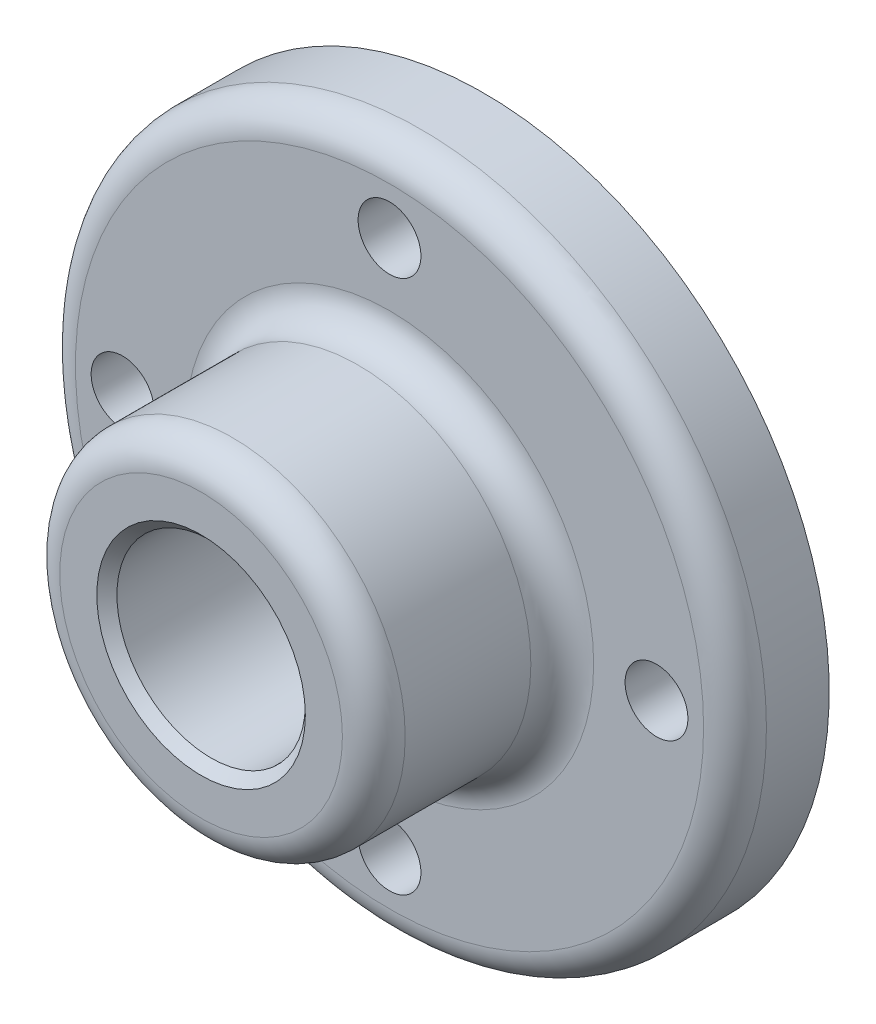
ISO-10303-21;
HEADER;
FILE_DESCRIPTION(('STEP AP214'),'2;1');
FILE_NAME('part.step','',(''),(''),'','','');
FILE_SCHEMA(('AUTOMOTIVE_DESIGN { 1 0 10303 214 1 1 1 1 }'));
ENDSEC;
DATA;
#1=APPLICATION_CONTEXT('core data for automotive mechanical design processes');
#2=APPLICATION_PROTOCOL_DEFINITION('international standard','automotive_design',2000,#1);
#3=PRODUCT_CONTEXT('',#1,'mechanical');
#4=PRODUCT('Part','Part','',(#3));
#5=PRODUCT_RELATED_PRODUCT_CATEGORY('part','',(#4));
#6=PRODUCT_DEFINITION_FORMATION('','',#4);
#7=PRODUCT_DEFINITION_CONTEXT('part definition',#1,'design');
#8=PRODUCT_DEFINITION('design','',#6,#7);
#9=PRODUCT_DEFINITION_SHAPE('','',#8);
#10=(LENGTH_UNIT() NAMED_UNIT(*) SI_UNIT(.MILLI.,.METRE.));
#11=(NAMED_UNIT(*) PLANE_ANGLE_UNIT() SI_UNIT($,.RADIAN.));
#12=(NAMED_UNIT(*) SI_UNIT($,.STERADIAN.) SOLID_ANGLE_UNIT());
#13=UNCERTAINTY_MEASURE_WITH_UNIT(LENGTH_MEASURE(1.E-05),#10,'distance_accuracy_value','');
#14=(GEOMETRIC_REPRESENTATION_CONTEXT(3) GLOBAL_UNCERTAINTY_ASSIGNED_CONTEXT((#13)) GLOBAL_UNIT_ASSIGNED_CONTEXT((#10,
#11,#12)) REPRESENTATION_CONTEXT('',''));
#15=CARTESIAN_POINT('',(0.,0.,0.));
#16=DIRECTION('',(0.,0.,1.));
#17=DIRECTION('',(1.,0.,0.));
#18=AXIS2_PLACEMENT_3D('',#15,#16,#17);
#19=CARTESIAN_POINT('',(0.,0.,19.05));
#20=DIRECTION('',(0.,0.,-1.));
#21=DIRECTION('',(-1.,0.,0.));
#22=AXIS2_PLACEMENT_3D('',#19,#20,#21);
#23=CYLINDRICAL_SURFACE('',#22,69.85);
#24=CARTESIAN_POINT('',(0.,0.,12.7));
#25=DIRECTION('',(0.,0.,1.));
#26=DIRECTION('',(1.,0.,0.));
#27=AXIS2_PLACEMENT_3D('',#24,#25,#26);
#28=CIRCLE('',#27,69.85);
#29=CARTESIAN_POINT('',(-69.85,0.,12.7));
#30=VERTEX_POINT('',#29);
#31=EDGE_CURVE('E64',#30,#30,#28,.F.);
#32=CARTESIAN_POINT('',(0.,0.,0.));
#33=DIRECTION('',(0.,0.,1.));
#34=DIRECTION('',(1.,0.,0.));
#35=AXIS2_PLACEMENT_3D('',#32,#33,#34);
#36=CIRCLE('',#35,69.85);
#37=CARTESIAN_POINT('',(-69.85,0.,0.));
#38=VERTEX_POINT('',#37);
#39=EDGE_CURVE('E76',#38,#38,#36,.T.);
#40=CARTESIAN_POINT('',(-69.85,0.,12.7));
#41=CARTESIAN_POINT('',(-69.85,0.,12.5677083333333));
#42=CARTESIAN_POINT('',(-69.85,0.,12.4354166666667));
#43=CARTESIAN_POINT('',(-69.85,0.,12.1708333333333));
#44=CARTESIAN_POINT('',(-69.85,0.,12.0385416666667));
#45=CARTESIAN_POINT('',(-69.85,0.,11.7739583333333));
#46=CARTESIAN_POINT('',(-69.85,0.,11.6416666666667));
#47=CARTESIAN_POINT('',(-69.85,0.,11.3770833333333));
#48=CARTESIAN_POINT('',(-69.85,0.,11.2447916666667));
#49=CARTESIAN_POINT('',(-69.85,0.,10.9802083333333));
#50=CARTESIAN_POINT('',(-69.85,0.,10.8479166666667));
#51=CARTESIAN_POINT('',(-69.85,0.,10.5833333333333));
#52=CARTESIAN_POINT('',(-69.85,0.,10.4510416666667));
#53=CARTESIAN_POINT('',(-69.85,0.,10.1864583333333));
#54=CARTESIAN_POINT('',(-69.85,0.,10.0541666666667));
#55=CARTESIAN_POINT('',(-69.85,0.,9.78958333333333));
#56=CARTESIAN_POINT('',(-69.85,0.,9.65729166666667));
#57=CARTESIAN_POINT('',(-69.85,0.,9.39270833333333));
#58=CARTESIAN_POINT('',(-69.85,0.,9.26041666666667));
#59=CARTESIAN_POINT('',(-69.85,0.,8.99583333333334));
#60=CARTESIAN_POINT('',(-69.85,0.,8.86354166666667));
#61=CARTESIAN_POINT('',(-69.85,0.,8.59895833333333));
#62=CARTESIAN_POINT('',(-69.85,0.,8.46666666666667));
#63=CARTESIAN_POINT('',(-69.85,0.,8.20208333333333));
#64=CARTESIAN_POINT('',(-69.85,0.,8.06979166666667));
#65=CARTESIAN_POINT('',(-69.85,0.,7.80520833333333));
#66=CARTESIAN_POINT('',(-69.85,0.,7.67291666666667));
#67=CARTESIAN_POINT('',(-69.85,0.,7.40833333333333));
#68=CARTESIAN_POINT('',(-69.85,0.,7.27604166666667));
#69=CARTESIAN_POINT('',(-69.85,0.,7.01145833333333));
#70=CARTESIAN_POINT('',(-69.85,0.,6.87916666666667));
#71=CARTESIAN_POINT('',(-69.85,0.,6.61458333333333));
#72=CARTESIAN_POINT('',(-69.85,0.,6.48229166666667));
#73=CARTESIAN_POINT('',(-69.85,0.,6.21770833333333));
#74=CARTESIAN_POINT('',(-69.85,0.,6.08541666666667));
#75=CARTESIAN_POINT('',(-69.85,0.,5.82083333333333));
#76=CARTESIAN_POINT('',(-69.85,0.,5.68854166666667));
#77=CARTESIAN_POINT('',(-69.85,0.,5.42395833333333));
#78=CARTESIAN_POINT('',(-69.85,0.,5.29166666666667));
#79=CARTESIAN_POINT('',(-69.85,0.,5.02708333333333));
#80=CARTESIAN_POINT('',(-69.85,0.,4.89479166666667));
#81=CARTESIAN_POINT('',(-69.85,0.,4.63020833333333));
#82=CARTESIAN_POINT('',(-69.85,0.,4.49791666666667));
#83=CARTESIAN_POINT('',(-69.85,0.,4.23333333333333));
#84=CARTESIAN_POINT('',(-69.85,0.,4.10104166666667));
#85=CARTESIAN_POINT('',(-69.85,0.,3.83645833333333));
#86=CARTESIAN_POINT('',(-69.85,0.,3.70416666666667));
#87=CARTESIAN_POINT('',(-69.85,0.,3.43958333333333));
#88=CARTESIAN_POINT('',(-69.85,0.,3.30729166666667));
#89=CARTESIAN_POINT('',(-69.85,0.,3.04270833333333));
#90=CARTESIAN_POINT('',(-69.85,0.,2.91041666666667));
#91=CARTESIAN_POINT('',(-69.85,0.,2.64583333333333));
#92=CARTESIAN_POINT('',(-69.85,0.,2.51354166666667));
#93=CARTESIAN_POINT('',(-69.85,0.,2.24895833333333));
#94=CARTESIAN_POINT('',(-69.85,0.,2.11666666666667));
#95=CARTESIAN_POINT('',(-69.85,0.,1.85208333333333));
#96=CARTESIAN_POINT('',(-69.85,0.,1.71979166666667));
#97=CARTESIAN_POINT('',(-69.85,0.,1.45520833333333));
#98=CARTESIAN_POINT('',(-69.85,0.,1.32291666666667));
#99=CARTESIAN_POINT('',(-69.85,0.,1.05833333333333));
#100=CARTESIAN_POINT('',(-69.85,0.,0.926041666666666));
#101=CARTESIAN_POINT('',(-69.85,0.,0.661458333333332));
#102=CARTESIAN_POINT('',(-69.85,0.,0.529166666666665));
#103=CARTESIAN_POINT('',(-69.85,0.,0.264583333333332));
#104=CARTESIAN_POINT('',(-69.85,0.,0.132291666666666));
#105=CARTESIAN_POINT('',(-69.85,0.,0.));
#106=B_SPLINE_CURVE_WITH_KNOTS('',3,(#40,#41,#42,#43,#44,#45,#46,#47,#48,#49,#50,#51,#52,#53,
#54,#55,#56,#57,#58,#59,#60,#61,#62,#63,#64,#65,#66,#67,#68,#69,#70,#71,#72,#73,#74,#75,#76,#77,
#78,#79,#80,#81,#82,#83,#84,#85,#86,#87,#88,#89,#90,#91,#92,#93,#94,#95,#96,#97,#98,#99,#100,
#101,#102,#103,#104,#105),.UNSPECIFIED.,.F.,.F.,(4,2,2,2,2,2,2,2,2,2,2,2,2,2,2,2,2,2,2,2,2,2,2,
2,2,2,2,2,2,2,2,2,4),(0.,0.396874999999998,0.793749999999999,1.190625,1.5875,1.984375,2.38125,
2.778125,3.175,3.571875,3.96875,4.365625,4.7625,5.159375,5.55625,5.953125,6.35,6.746875,7.14375,
7.540625,7.9375,8.334375,8.73125,9.128125,9.525,9.921875,10.31875,10.715625,11.1125,11.509375,
11.90625,12.303125,12.7),.UNSPECIFIED.);
#107=EDGE_CURVE('BSEAM36',#30,#38,#106,.T.);
#108=ORIENTED_EDGE('',*,*,#31,.T.);
#109=ORIENTED_EDGE('',*,*,#39,.T.);
#110=ORIENTED_EDGE('',*,*,#107,.T.);
#111=ORIENTED_EDGE('',*,*,#107,.F.);
#112=EDGE_LOOP('',(#108,#110,#109,#111));
#113=FACE_BOUND('',#112,.T.);
#114=ADVANCED_FACE('F36',(#113),#23,.T.);
#115=CARTESIAN_POINT('',(0.,0.,19.05));
#116=DIRECTION('',(0.,0.,1.));
#117=DIRECTION('',(1.,0.,0.));
#118=AXIS2_PLACEMENT_3D('',#115,#116,#117);
#119=PLANE('',#118);
#120=CARTESIAN_POINT('',(0.,0.,19.05));
#121=DIRECTION('',(0.,0.,1.));
#122=DIRECTION('',(1.,0.,0.));
#123=AXIS2_PLACEMENT_3D('',#120,#121,#122);
#124=CIRCLE('',#123,63.5);
#125=CARTESIAN_POINT('',(63.5,0.,19.05));
#126=VERTEX_POINT('',#125);
#127=EDGE_CURVE('E68',#126,#126,#124,.T.);
#128=ORIENTED_EDGE('',*,*,#127,.T.);
#129=EDGE_LOOP('',(#128));
#130=FACE_BOUND('',#129,.T.);
#131=CARTESIAN_POINT('',(0.,0.,19.05));
#132=DIRECTION('',(0.,0.,1.));
#133=DIRECTION('',(1.,0.,0.));
#134=AXIS2_PLACEMENT_3D('',#131,#132,#133);
#135=CIRCLE('',#134,41.275);
#136=CARTESIAN_POINT('',(41.275,0.,19.05));
#137=VERTEX_POINT('',#136);
#138=EDGE_CURVE('E72',#137,#137,#135,.F.);
#139=ORIENTED_EDGE('',*,*,#138,.T.);
#140=EDGE_LOOP('',(#139));
#141=FACE_BOUND('',#140,.T.);
#142=CARTESIAN_POINT('',(-53.975,-1.88452705264058E-13,19.05));
#143=DIRECTION('',(0.,0.,1.));
#144=DIRECTION('',(1.,0.,0.));
#145=AXIS2_PLACEMENT_3D('',#142,#143,#144);
#146=CIRCLE('',#145,6.35);
#147=CARTESIAN_POINT('',(-47.625,-1.88452705264058E-13,19.05));
#148=VERTEX_POINT('',#147);
#149=EDGE_CURVE('E92',#148,#148,#146,.T.);
#150=ORIENTED_EDGE('',*,*,#149,.F.);
#151=EDGE_LOOP('',(#150));
#152=FACE_BOUND('',#151,.T.);
#153=CARTESIAN_POINT('',(0.,-53.975,19.05));
#154=DIRECTION('',(0.,0.,1.));
#155=DIRECTION('',(1.,0.,0.));
#156=AXIS2_PLACEMENT_3D('',#153,#154,#155);
#157=CIRCLE('',#156,6.35);
#158=CARTESIAN_POINT('',(6.35,-53.975,19.05));
#159=VERTEX_POINT('',#158);
#160=EDGE_CURVE('E96',#159,#159,#157,.T.);
#161=ORIENTED_EDGE('',*,*,#160,.F.);
#162=EDGE_LOOP('',(#161));
#163=FACE_BOUND('',#162,.T.);
#164=CARTESIAN_POINT('',(53.975,5.65358115792174E-13,19.05));
#165=DIRECTION('',(0.,0.,1.));
#166=DIRECTION('',(1.,0.,0.));
#167=AXIS2_PLACEMENT_3D('',#164,#165,#166);
#168=CIRCLE('',#167,6.35);
#169=CARTESIAN_POINT('',(60.325,5.65358115792174E-13,19.05));
#170=VERTEX_POINT('',#169);
#171=EDGE_CURVE('E100',#170,#170,#168,.T.);
#172=ORIENTED_EDGE('',*,*,#171,.F.);
#173=EDGE_LOOP('',(#172));
#174=FACE_BOUND('',#173,.T.);
#175=CARTESIAN_POINT('',(0.,53.975,19.05));
#176=DIRECTION('',(0.,0.,1.));
#177=DIRECTION('',(1.,0.,0.));
#178=AXIS2_PLACEMENT_3D('',#175,#176,#177);
#179=CIRCLE('',#178,6.35);
#180=CARTESIAN_POINT('',(6.35,53.975,19.05));
#181=VERTEX_POINT('',#180);
#182=EDGE_CURVE('E84',#181,#181,#179,.T.);
#183=ORIENTED_EDGE('',*,*,#182,.F.);
#184=EDGE_LOOP('',(#183));
#185=FACE_BOUND('',#184,.T.);
#186=ADVANCED_FACE('F137',(#130,#141,#152,#163,#174,#185),#119,.T.);
#187=CARTESIAN_POINT('',(0.,0.,0.));
#188=DIRECTION('',(0.,0.,1.));
#189=DIRECTION('',(1.,0.,0.));
#190=AXIS2_PLACEMENT_3D('',#187,#188,#189);
#191=PLANE('',#190);
#192=CARTESIAN_POINT('',(-53.975,-1.88452705264058E-13,0.));
#193=DIRECTION('',(0.,0.,1.));
#194=DIRECTION('',(0.,1.,0.));
#195=AXIS2_PLACEMENT_3D('',#192,#193,#194);
#196=CIRCLE('',#195,6.35);
#197=CARTESIAN_POINT('',(-47.625,-1.88452705264058E-13,0.));
#198=VERTEX_POINT('',#197);
#199=EDGE_CURVE('E104',#198,#198,#196,.T.);
#200=ORIENTED_EDGE('',*,*,#199,.T.);
#201=EDGE_LOOP('',(#200));
#202=FACE_BOUND('',#201,.T.);
#203=CARTESIAN_POINT('',(0.,-53.975,0.));
#204=DIRECTION('',(0.,0.,1.));
#205=DIRECTION('',(-1.,0.,0.));
#206=AXIS2_PLACEMENT_3D('',#203,#204,#205);
#207=CIRCLE('',#206,6.35);
#208=CARTESIAN_POINT('',(6.35,-53.975,0.));
#209=VERTEX_POINT('',#208);
#210=EDGE_CURVE('E109',#209,#209,#207,.T.);
#211=ORIENTED_EDGE('',*,*,#210,.T.);
#212=EDGE_LOOP('',(#211));
#213=FACE_BOUND('',#212,.T.);
#214=CARTESIAN_POINT('',(53.975,5.65358115792174E-13,0.));
#215=DIRECTION('',(0.,0.,1.));
#216=DIRECTION('',(0.,-1.,0.));
#217=AXIS2_PLACEMENT_3D('',#214,#215,#216);
#218=CIRCLE('',#217,6.35);
#219=CARTESIAN_POINT('',(60.325,5.65358115792174E-13,0.));
#220=VERTEX_POINT('',#219);
#221=EDGE_CURVE('E105',#220,#220,#218,.T.);
#222=ORIENTED_EDGE('',*,*,#221,.T.);
#223=EDGE_LOOP('',(#222));
#224=FACE_BOUND('',#223,.T.);
#225=CARTESIAN_POINT('',(0.,53.975,0.));
#226=DIRECTION('',(0.,0.,1.));
#227=DIRECTION('',(1.,0.,0.));
#228=AXIS2_PLACEMENT_3D('',#225,#226,#227);
#229=CIRCLE('',#228,6.35);
#230=CARTESIAN_POINT('',(6.35,53.975,0.));
#231=VERTEX_POINT('',#230);
#232=EDGE_CURVE('E88',#231,#231,#229,.T.);
#233=ORIENTED_EDGE('',*,*,#232,.T.);
#234=EDGE_LOOP('',(#233));
#235=FACE_BOUND('',#234,.T.);
#236=CARTESIAN_POINT('',(0.,0.,0.));
#237=DIRECTION('',(0.,0.,1.));
#238=DIRECTION('',(1.,0.,0.));
#239=AXIS2_PLACEMENT_3D('',#236,#237,#238);
#240=CIRCLE('',#239,19.05);
#241=CARTESIAN_POINT('',(19.05,0.,0.));
#242=VERTEX_POINT('',#241);
#243=EDGE_CURVE('E80',#242,#242,#240,.T.);
#244=ORIENTED_EDGE('',*,*,#243,.T.);
#245=EDGE_LOOP('',(#244));
#246=FACE_BOUND('',#245,.T.);
#247=ORIENTED_EDGE('',*,*,#39,.F.);
#248=EDGE_LOOP('',(#247));
#249=FACE_BOUND('',#248,.T.);
#250=ADVANCED_FACE('F117',(#202,#213,#224,#235,#246,#249),#191,.F.);
#251=CARTESIAN_POINT('',(0.,0.,-0.002000000000002));
#252=DIRECTION('',(0.,0.,1.));
#253=DIRECTION('',(1.,0.,0.));
#254=AXIS2_PLACEMENT_3D('',#251,#252,#253);
#255=CYLINDRICAL_SURFACE('',#254,34.925);
#256=CARTESIAN_POINT('',(0.,0.,25.4));
#257=DIRECTION('',(0.,0.,1.));
#258=DIRECTION('',(1.,0.,0.));
#259=AXIS2_PLACEMENT_3D('',#256,#257,#258);
#260=CIRCLE('',#259,34.925);
#261=CARTESIAN_POINT('',(34.925,0.,25.4));
#262=VERTEX_POINT('',#261);
#263=EDGE_CURVE('E54',#262,#262,#260,.T.);
#264=ORIENTED_EDGE('',*,*,#263,.T.);
#265=EDGE_LOOP('',(#264));
#266=FACE_BOUND('',#265,.T.);
#267=CARTESIAN_POINT('',(0.,0.,50.8));
#268=DIRECTION('',(0.,0.,1.));
#269=DIRECTION('',(1.,0.,0.));
#270=AXIS2_PLACEMENT_3D('',#267,#268,#269);
#271=CIRCLE('',#270,34.925);
#272=CARTESIAN_POINT('',(34.925,0.,50.8));
#273=VERTEX_POINT('',#272);
#274=EDGE_CURVE('E60',#273,#273,#271,.F.);
#275=ORIENTED_EDGE('',*,*,#274,.T.);
#276=EDGE_LOOP('',(#275));
#277=FACE_BOUND('',#276,.T.);
#278=ADVANCED_FACE('F164',(#266,#277),#255,.T.);
#279=CARTESIAN_POINT('',(0.,0.,57.15));
#280=DIRECTION('',(0.,0.,1.));
#281=DIRECTION('',(1.,0.,0.));
#282=AXIS2_PLACEMENT_3D('',#279,#280,#281);
#283=PLANE('',#282);
#284=CARTESIAN_POINT('',(0.,0.,57.15));
#285=DIRECTION('',(0.,0.,1.));
#286=DIRECTION('',(1.,0.,0.));
#287=AXIS2_PLACEMENT_3D('',#284,#285,#286);
#288=CIRCLE('',#287,21.082);
#289=CARTESIAN_POINT('',(21.082,0.,57.15));
#290=VERTEX_POINT('',#289);
#291=EDGE_CURVE('E10',#290,#290,#288,.F.);
#292=ORIENTED_EDGE('',*,*,#291,.T.);
#293=EDGE_LOOP('',(#292));
#294=FACE_BOUND('',#293,.T.);
#295=CARTESIAN_POINT('',(0.,0.,57.15));
#296=DIRECTION('',(0.,0.,1.));
#297=DIRECTION('',(1.,0.,0.));
#298=AXIS2_PLACEMENT_3D('',#295,#296,#297);
#299=CIRCLE('',#298,28.575);
#300=CARTESIAN_POINT('',(28.575,0.,57.15));
#301=VERTEX_POINT('',#300);
#302=EDGE_CURVE('E49',#301,#301,#299,.T.);
#303=ORIENTED_EDGE('',*,*,#302,.T.);
#304=EDGE_LOOP('',(#303));
#305=FACE_BOUND('',#304,.T.);
#306=ADVANCED_FACE('F161',(#294,#305),#283,.T.);
#307=CARTESIAN_POINT('',(0.,0.,0.));
#308=DIRECTION('',(0.,0.,1.));
#309=DIRECTION('',(1.,0.,0.));
#310=AXIS2_PLACEMENT_3D('',#307,#308,#309);
#311=CYLINDRICAL_SURFACE('',#310,19.05);
#312=CARTESIAN_POINT('',(0.,0.,55.118));
#313=DIRECTION('',(0.,0.,1.));
#314=DIRECTION('',(1.,0.,0.));
#315=AXIS2_PLACEMENT_3D('',#312,#313,#314);
#316=CIRCLE('',#315,19.05);
#317=CARTESIAN_POINT('',(19.05,0.,55.118));
#318=VERTEX_POINT('',#317);
#319=EDGE_CURVE('E44',#318,#318,#316,.T.);
#320=ORIENTED_EDGE('',*,*,#319,.T.);
#321=EDGE_LOOP('',(#320));
#322=FACE_BOUND('',#321,.T.);
#323=ORIENTED_EDGE('',*,*,#243,.F.);
#324=EDGE_LOOP('',(#323));
#325=FACE_BOUND('',#324,.T.);
#326=ADVANCED_FACE('F163',(#322,#325),#311,.F.);
#327=CARTESIAN_POINT('',(0.,53.975,0.));
#328=DIRECTION('',(0.,0.,1.));
#329=DIRECTION('',(1.,0.,0.));
#330=AXIS2_PLACEMENT_3D('',#327,#328,#329);
#331=CYLINDRICAL_SURFACE('',#330,6.35);
#332=CARTESIAN_POINT('',(6.35,53.975,19.05));
#333=CARTESIAN_POINT('',(6.35,53.975,18.8515625));
#334=CARTESIAN_POINT('',(6.35,53.975,18.653125));
#335=CARTESIAN_POINT('',(6.35,53.975,18.25625));
#336=CARTESIAN_POINT('',(6.35,53.975,18.0578125));
#337=CARTESIAN_POINT('',(6.35,53.975,17.6609375));
#338=CARTESIAN_POINT('',(6.35,53.975,17.4625));
#339=CARTESIAN_POINT('',(6.35,53.975,17.065625));
#340=CARTESIAN_POINT('',(6.35,53.975,16.8671875));
#341=CARTESIAN_POINT('',(6.35,53.975,16.4703125));
#342=CARTESIAN_POINT('',(6.35,53.975,16.271875));
#343=CARTESIAN_POINT('',(6.35,53.975,15.875));
#344=CARTESIAN_POINT('',(6.35,53.975,15.6765625));
#345=CARTESIAN_POINT('',(6.35,53.975,15.2796875));
#346=CARTESIAN_POINT('',(6.35,53.975,15.08125));
#347=CARTESIAN_POINT('',(6.35,53.975,14.684375));
#348=CARTESIAN_POINT('',(6.35,53.975,14.4859375));
#349=CARTESIAN_POINT('',(6.35,53.975,14.0890625));
#350=CARTESIAN_POINT('',(6.35,53.975,13.890625));
#351=CARTESIAN_POINT('',(6.35,53.975,13.49375));
#352=CARTESIAN_POINT('',(6.35,53.975,13.2953125));
#353=CARTESIAN_POINT('',(6.35,53.975,12.8984375));
#354=CARTESIAN_POINT('',(6.35,53.975,12.7));
#355=CARTESIAN_POINT('',(6.35,53.975,12.303125));
#356=CARTESIAN_POINT('',(6.35,53.975,12.1046875));
#357=CARTESIAN_POINT('',(6.35,53.975,11.7078125));
#358=CARTESIAN_POINT('',(6.35,53.975,11.509375));
#359=CARTESIAN_POINT('',(6.35,53.975,11.1125));
#360=CARTESIAN_POINT('',(6.35,53.975,10.9140625));
#361=CARTESIAN_POINT('',(6.35,53.975,10.5171875));
#362=CARTESIAN_POINT('',(6.35,53.975,10.31875));
#363=CARTESIAN_POINT('',(6.35,53.975,9.921875));
#364=CARTESIAN_POINT('',(6.35,53.975,9.7234375));
#365=CARTESIAN_POINT('',(6.35,53.975,9.3265625));
#366=CARTESIAN_POINT('',(6.35,53.975,9.128125));
#367=CARTESIAN_POINT('',(6.35,53.975,8.73125));
#368=CARTESIAN_POINT('',(6.35,53.975,8.5328125));
#369=CARTESIAN_POINT('',(6.35,53.975,8.1359375));
#370=CARTESIAN_POINT('',(6.35,53.975,7.9375));
#371=CARTESIAN_POINT('',(6.35,53.975,7.540625));
#372=CARTESIAN_POINT('',(6.35,53.975,7.3421875));
#373=CARTESIAN_POINT('',(6.35,53.975,6.9453125));
#374=CARTESIAN_POINT('',(6.35,53.975,6.746875));
#375=CARTESIAN_POINT('',(6.35,53.975,6.35));
#376=CARTESIAN_POINT('',(6.35,53.975,6.1515625));
#377=CARTESIAN_POINT('',(6.35,53.975,5.7546875));
#378=CARTESIAN_POINT('',(6.35,53.975,5.55625));
#379=CARTESIAN_POINT('',(6.35,53.975,5.159375));
#380=CARTESIAN_POINT('',(6.35,53.975,4.9609375));
#381=CARTESIAN_POINT('',(6.35,53.975,4.5640625));
#382=CARTESIAN_POINT('',(6.35,53.975,4.365625));
#383=CARTESIAN_POINT('',(6.35,53.975,3.96875));
#384=CARTESIAN_POINT('',(6.35,53.975,3.7703125));
#385=CARTESIAN_POINT('',(6.35,53.975,3.3734375));
#386=CARTESIAN_POINT('',(6.35,53.975,3.175));
#387=CARTESIAN_POINT('',(6.35,53.975,2.778125));
#388=CARTESIAN_POINT('',(6.35,53.975,2.5796875));
#389=CARTESIAN_POINT('',(6.35,53.975,2.1828125));
#390=CARTESIAN_POINT('',(6.35,53.975,1.984375));
#391=CARTESIAN_POINT('',(6.35,53.975,1.5875));
#392=CARTESIAN_POINT('',(6.35,53.975,1.3890625));
#393=CARTESIAN_POINT('',(6.35,53.975,0.9921875));
#394=CARTESIAN_POINT('',(6.35,53.975,0.79375));
#395=CARTESIAN_POINT('',(6.35,53.975,0.396875));
#396=CARTESIAN_POINT('',(6.35,53.975,0.1984375));
#397=CARTESIAN_POINT('',(6.35,53.975,0.));
#398=B_SPLINE_CURVE_WITH_KNOTS('',3,(#332,#333,#334,#335,#336,#337,#338,#339,#340,#341,#342,
#343,#344,#345,#346,#347,#348,#349,#350,#351,#352,#353,#354,#355,#356,#357,#358,#359,#360,#361,
#362,#363,#364,#365,#366,#367,#368,#369,#370,#371,#372,#373,#374,#375,#376,#377,#378,#379,#380,
#381,#382,#383,#384,#385,#386,#387,#388,#389,#390,#391,#392,#393,#394,#395,#396,#397),
.UNSPECIFIED.,.F.,.F.,(4,2,2,2,2,2,2,2,2,2,2,2,2,2,2,2,2,2,2,2,2,2,2,2,2,2,2,2,2,2,2,2,4),(0.,
0.5953125,1.190625,1.7859375,2.38125,2.9765625,3.571875,4.1671875,4.7625,5.3578125,5.953125,
6.5484375,7.14375,7.7390625,8.334375,8.9296875,9.525,10.1203125,10.715625,11.3109375,11.90625,
12.5015625,13.096875,13.6921875,14.2875,14.8828125,15.478125,16.0734375,16.66875,17.2640625,
17.859375,18.4546875,19.05),.UNSPECIFIED.);
#399=EDGE_CURVE('BSEAM170',#181,#231,#398,.T.);
#400=ORIENTED_EDGE('',*,*,#182,.T.);
#401=ORIENTED_EDGE('',*,*,#232,.F.);
#402=ORIENTED_EDGE('',*,*,#399,.T.);
#403=ORIENTED_EDGE('',*,*,#399,.F.);
#404=EDGE_LOOP('',(#400,#402,#401,#403));
#405=FACE_BOUND('',#404,.T.);
#406=ADVANCED_FACE('F170',(#405),#331,.F.);
#407=CARTESIAN_POINT('',(53.975,5.65358115792174E-13,0.));
#408=DIRECTION('',(0.,0.,1.));
#409=DIRECTION('',(1.,0.,0.));
#410=AXIS2_PLACEMENT_3D('',#407,#408,#409);
#411=CYLINDRICAL_SURFACE('',#410,6.35);
#412=CARTESIAN_POINT('',(60.325,5.65358115792174E-13,19.05));
#413=CARTESIAN_POINT('',(60.325,5.65358115792174E-13,18.8515625));
#414=CARTESIAN_POINT('',(60.325,5.65358115792174E-13,18.653125));
#415=CARTESIAN_POINT('',(60.325,5.65358115792174E-13,18.25625));
#416=CARTESIAN_POINT('',(60.325,5.65358115792174E-13,18.0578125));
#417=CARTESIAN_POINT('',(60.325,5.65358115792174E-13,17.6609375));
#418=CARTESIAN_POINT('',(60.325,5.65358115792174E-13,17.4625));
#419=CARTESIAN_POINT('',(60.325,5.65358115792174E-13,17.065625));
#420=CARTESIAN_POINT('',(60.325,5.65358115792174E-13,16.8671875));
#421=CARTESIAN_POINT('',(60.325,5.65358115792174E-13,16.4703125));
#422=CARTESIAN_POINT('',(60.325,5.65358115792174E-13,16.271875));
#423=CARTESIAN_POINT('',(60.325,5.65358115792174E-13,15.875));
#424=CARTESIAN_POINT('',(60.325,5.65358115792174E-13,15.6765625));
#425=CARTESIAN_POINT('',(60.325,5.65358115792174E-13,15.2796875));
#426=CARTESIAN_POINT('',(60.325,5.65358115792174E-13,15.08125));
#427=CARTESIAN_POINT('',(60.325,5.65358115792174E-13,14.684375));
#428=CARTESIAN_POINT('',(60.325,5.65358115792174E-13,14.4859375));
#429=CARTESIAN_POINT('',(60.325,5.65358115792174E-13,14.0890625));
#430=CARTESIAN_POINT('',(60.325,5.65358115792174E-13,13.890625));
#431=CARTESIAN_POINT('',(60.325,5.65358115792174E-13,13.49375));
#432=CARTESIAN_POINT('',(60.325,5.65358115792174E-13,13.2953125));
#433=CARTESIAN_POINT('',(60.325,5.65358115792174E-13,12.8984375));
#434=CARTESIAN_POINT('',(60.325,5.65358115792174E-13,12.7));
#435=CARTESIAN_POINT('',(60.325,5.65358115792174E-13,12.303125));
#436=CARTESIAN_POINT('',(60.325,5.65358115792174E-13,12.1046875));
#437=CARTESIAN_POINT('',(60.325,5.65358115792174E-13,11.7078125));
#438=CARTESIAN_POINT('',(60.325,5.65358115792174E-13,11.509375));
#439=CARTESIAN_POINT('',(60.325,5.65358115792174E-13,11.1125));
#440=CARTESIAN_POINT('',(60.325,5.65358115792174E-13,10.9140625));
#441=CARTESIAN_POINT('',(60.325,5.65358115792174E-13,10.5171875));
#442=CARTESIAN_POINT('',(60.325,5.65358115792174E-13,10.31875));
#443=CARTESIAN_POINT('',(60.325,5.65358115792174E-13,9.921875));
#444=CARTESIAN_POINT('',(60.325,5.65358115792174E-13,9.7234375));
#445=CARTESIAN_POINT('',(60.325,5.65358115792174E-13,9.3265625));
#446=CARTESIAN_POINT('',(60.325,5.65358115792174E-13,9.128125));
#447=CARTESIAN_POINT('',(60.325,5.65358115792174E-13,8.73125));
#448=CARTESIAN_POINT('',(60.325,5.65358115792174E-13,8.5328125));
#449=CARTESIAN_POINT('',(60.325,5.65358115792174E-13,8.1359375));
#450=CARTESIAN_POINT('',(60.325,5.65358115792174E-13,7.9375));
#451=CARTESIAN_POINT('',(60.325,5.65358115792174E-13,7.540625));
#452=CARTESIAN_POINT('',(60.325,5.65358115792174E-13,7.3421875));
#453=CARTESIAN_POINT('',(60.325,5.65358115792174E-13,6.9453125));
#454=CARTESIAN_POINT('',(60.325,5.65358115792174E-13,6.746875));
#455=CARTESIAN_POINT('',(60.325,5.65358115792174E-13,6.35));
#456=CARTESIAN_POINT('',(60.325,5.65358115792174E-13,6.1515625));
#457=CARTESIAN_POINT('',(60.325,5.65358115792174E-13,5.7546875));
#458=CARTESIAN_POINT('',(60.325,5.65358115792174E-13,5.55625));
#459=CARTESIAN_POINT('',(60.325,5.65358115792174E-13,5.159375));
#460=CARTESIAN_POINT('',(60.325,5.65358115792174E-13,4.9609375));
#461=CARTESIAN_POINT('',(60.325,5.65358115792174E-13,4.5640625));
#462=CARTESIAN_POINT('',(60.325,5.65358115792174E-13,4.365625));
#463=CARTESIAN_POINT('',(60.325,5.65358115792174E-13,3.96875));
#464=CARTESIAN_POINT('',(60.325,5.65358115792174E-13,3.7703125));
#465=CARTESIAN_POINT('',(60.325,5.65358115792174E-13,3.3734375));
#466=CARTESIAN_POINT('',(60.325,5.65358115792174E-13,3.175));
#467=CARTESIAN_POINT('',(60.325,5.65358115792174E-13,2.778125));
#468=CARTESIAN_POINT('',(60.325,5.65358115792174E-13,2.5796875));
#469=CARTESIAN_POINT('',(60.325,5.65358115792174E-13,2.1828125));
#470=CARTESIAN_POINT('',(60.325,5.65358115792174E-13,1.984375));
#471=CARTESIAN_POINT('',(60.325,5.65358115792174E-13,1.5875));
#472=CARTESIAN_POINT('',(60.325,5.65358115792174E-13,1.3890625));
#473=CARTESIAN_POINT('',(60.325,5.65358115792174E-13,0.9921875));
#474=CARTESIAN_POINT('',(60.325,5.65358115792174E-13,0.79375));
#475=CARTESIAN_POINT('',(60.325,5.65358115792174E-13,0.396875));
#476=CARTESIAN_POINT('',(60.325,5.65358115792174E-13,0.1984375));
#477=CARTESIAN_POINT('',(60.325,5.65358115792174E-13,0.));
#478=B_SPLINE_CURVE_WITH_KNOTS('',3,(#412,#413,#414,#415,#416,#417,#418,#419,#420,#421,#422,
#423,#424,#425,#426,#427,#428,#429,#430,#431,#432,#433,#434,#435,#436,#437,#438,#439,#440,#441,
#442,#443,#444,#445,#446,#447,#448,#449,#450,#451,#452,#453,#454,#455,#456,#457,#458,#459,#460,
#461,#462,#463,#464,#465,#466,#467,#468,#469,#470,#471,#472,#473,#474,#475,#476,#477),
.UNSPECIFIED.,.F.,.F.,(4,2,2,2,2,2,2,2,2,2,2,2,2,2,2,2,2,2,2,2,2,2,2,2,2,2,2,2,2,2,2,2,4),(0.,
0.5953125,1.190625,1.7859375,2.38125,2.9765625,3.571875,4.1671875,4.7625,5.3578125,5.953125,
6.5484375,7.14375,7.7390625,8.334375,8.9296875,9.525,10.1203125,10.715625,11.3109375,11.90625,
12.5015625,13.096875,13.6921875,14.2875,14.8828125,15.478125,16.0734375,16.66875,17.2640625,
17.859375,18.4546875,19.05),.UNSPECIFIED.);
#479=EDGE_CURVE('BSEAM133',#170,#220,#478,.T.);
#480=ORIENTED_EDGE('',*,*,#171,.T.);
#481=ORIENTED_EDGE('',*,*,#221,.F.);
#482=ORIENTED_EDGE('',*,*,#479,.T.);
#483=ORIENTED_EDGE('',*,*,#479,.F.);
#484=EDGE_LOOP('',(#480,#482,#481,#483));
#485=FACE_BOUND('',#484,.T.);
#486=ADVANCED_FACE('F133',(#485),#411,.F.);
#487=CARTESIAN_POINT('',(0.,-53.975,0.));
#488=DIRECTION('',(0.,0.,1.));
#489=DIRECTION('',(1.,0.,0.));
#490=AXIS2_PLACEMENT_3D('',#487,#488,#489);
#491=CYLINDRICAL_SURFACE('',#490,6.35);
#492=CARTESIAN_POINT('',(6.35,-53.975,19.05));
#493=CARTESIAN_POINT('',(6.35,-53.975,18.8515625));
#494=CARTESIAN_POINT('',(6.35,-53.975,18.653125));
#495=CARTESIAN_POINT('',(6.35,-53.975,18.25625));
#496=CARTESIAN_POINT('',(6.35,-53.975,18.0578125));
#497=CARTESIAN_POINT('',(6.35,-53.975,17.6609375));
#498=CARTESIAN_POINT('',(6.35,-53.975,17.4625));
#499=CARTESIAN_POINT('',(6.35,-53.975,17.065625));
#500=CARTESIAN_POINT('',(6.35,-53.975,16.8671875));
#501=CARTESIAN_POINT('',(6.35,-53.975,16.4703125));
#502=CARTESIAN_POINT('',(6.35,-53.975,16.271875));
#503=CARTESIAN_POINT('',(6.35,-53.975,15.875));
#504=CARTESIAN_POINT('',(6.35,-53.975,15.6765625));
#505=CARTESIAN_POINT('',(6.35,-53.975,15.2796875));
#506=CARTESIAN_POINT('',(6.35,-53.975,15.08125));
#507=CARTESIAN_POINT('',(6.35,-53.975,14.684375));
#508=CARTESIAN_POINT('',(6.35,-53.975,14.4859375));
#509=CARTESIAN_POINT('',(6.35,-53.975,14.0890625));
#510=CARTESIAN_POINT('',(6.35,-53.975,13.890625));
#511=CARTESIAN_POINT('',(6.35,-53.975,13.49375));
#512=CARTESIAN_POINT('',(6.35,-53.975,13.2953125));
#513=CARTESIAN_POINT('',(6.35,-53.975,12.8984375));
#514=CARTESIAN_POINT('',(6.35,-53.975,12.7));
#515=CARTESIAN_POINT('',(6.35,-53.975,12.303125));
#516=CARTESIAN_POINT('',(6.35,-53.975,12.1046875));
#517=CARTESIAN_POINT('',(6.35,-53.975,11.7078125));
#518=CARTESIAN_POINT('',(6.35,-53.975,11.509375));
#519=CARTESIAN_POINT('',(6.35,-53.975,11.1125));
#520=CARTESIAN_POINT('',(6.35,-53.975,10.9140625));
#521=CARTESIAN_POINT('',(6.35,-53.975,10.5171875));
#522=CARTESIAN_POINT('',(6.35,-53.975,10.31875));
#523=CARTESIAN_POINT('',(6.35,-53.975,9.921875));
#524=CARTESIAN_POINT('',(6.35,-53.975,9.7234375));
#525=CARTESIAN_POINT('',(6.35,-53.975,9.3265625));
#526=CARTESIAN_POINT('',(6.35,-53.975,9.128125));
#527=CARTESIAN_POINT('',(6.35,-53.975,8.73125));
#528=CARTESIAN_POINT('',(6.35,-53.975,8.5328125));
#529=CARTESIAN_POINT('',(6.35,-53.975,8.1359375));
#530=CARTESIAN_POINT('',(6.35,-53.975,7.9375));
#531=CARTESIAN_POINT('',(6.35,-53.975,7.540625));
#532=CARTESIAN_POINT('',(6.35,-53.975,7.3421875));
#533=CARTESIAN_POINT('',(6.35,-53.975,6.9453125));
#534=CARTESIAN_POINT('',(6.35,-53.975,6.746875));
#535=CARTESIAN_POINT('',(6.35,-53.975,6.35));
#536=CARTESIAN_POINT('',(6.35,-53.975,6.1515625));
#537=CARTESIAN_POINT('',(6.35,-53.975,5.7546875));
#538=CARTESIAN_POINT('',(6.35,-53.975,5.55625));
#539=CARTESIAN_POINT('',(6.35,-53.975,5.159375));
#540=CARTESIAN_POINT('',(6.35,-53.975,4.9609375));
#541=CARTESIAN_POINT('',(6.35,-53.975,4.5640625));
#542=CARTESIAN_POINT('',(6.35,-53.975,4.365625));
#543=CARTESIAN_POINT('',(6.35,-53.975,3.96875));
#544=CARTESIAN_POINT('',(6.35,-53.975,3.7703125));
#545=CARTESIAN_POINT('',(6.35,-53.975,3.3734375));
#546=CARTESIAN_POINT('',(6.35,-53.975,3.175));
#547=CARTESIAN_POINT('',(6.35,-53.975,2.778125));
#548=CARTESIAN_POINT('',(6.35,-53.975,2.5796875));
#549=CARTESIAN_POINT('',(6.35,-53.975,2.1828125));
#550=CARTESIAN_POINT('',(6.35,-53.975,1.984375));
#551=CARTESIAN_POINT('',(6.35,-53.975,1.5875));
#552=CARTESIAN_POINT('',(6.35,-53.975,1.3890625));
#553=CARTESIAN_POINT('',(6.35,-53.975,0.9921875));
#554=CARTESIAN_POINT('',(6.35,-53.975,0.79375));
#555=CARTESIAN_POINT('',(6.35,-53.975,0.396875));
#556=CARTESIAN_POINT('',(6.35,-53.975,0.1984375));
#557=CARTESIAN_POINT('',(6.35,-53.975,0.));
#558=B_SPLINE_CURVE_WITH_KNOTS('',3,(#492,#493,#494,#495,#496,#497,#498,#499,#500,#501,#502,
#503,#504,#505,#506,#507,#508,#509,#510,#511,#512,#513,#514,#515,#516,#517,#518,#519,#520,#521,
#522,#523,#524,#525,#526,#527,#528,#529,#530,#531,#532,#533,#534,#535,#536,#537,#538,#539,#540,
#541,#542,#543,#544,#545,#546,#547,#548,#549,#550,#551,#552,#553,#554,#555,#556,#557),
.UNSPECIFIED.,.F.,.F.,(4,2,2,2,2,2,2,2,2,2,2,2,2,2,2,2,2,2,2,2,2,2,2,2,2,2,2,2,2,2,2,2,4),(0.,
0.5953125,1.190625,1.7859375,2.38125,2.9765625,3.571875,4.1671875,4.7625,5.3578125,5.953125,
6.5484375,7.14375,7.7390625,8.334375,8.9296875,9.525,10.1203125,10.715625,11.3109375,11.90625,
12.5015625,13.096875,13.6921875,14.2875,14.8828125,15.478125,16.0734375,16.66875,17.2640625,
17.859375,18.4546875,19.05),.UNSPECIFIED.);
#559=EDGE_CURVE('BSEAM123',#159,#209,#558,.T.);
#560=ORIENTED_EDGE('',*,*,#160,.T.);
#561=ORIENTED_EDGE('',*,*,#210,.F.);
#562=ORIENTED_EDGE('',*,*,#559,.T.);
#563=ORIENTED_EDGE('',*,*,#559,.F.);
#564=EDGE_LOOP('',(#560,#562,#561,#563));
#565=FACE_BOUND('',#564,.T.);
#566=ADVANCED_FACE('F123',(#565),#491,.F.);
#567=CARTESIAN_POINT('',(-53.975,-1.88452705264058E-13,0.));
#568=DIRECTION('',(0.,0.,1.));
#569=DIRECTION('',(1.,0.,0.));
#570=AXIS2_PLACEMENT_3D('',#567,#568,#569);
#571=CYLINDRICAL_SURFACE('',#570,6.35);
#572=CARTESIAN_POINT('',(-47.625,-1.88452705264058E-13,19.05));
#573=CARTESIAN_POINT('',(-47.625,-1.88452705264058E-13,18.8515625));
#574=CARTESIAN_POINT('',(-47.625,-1.88452705264058E-13,18.653125));
#575=CARTESIAN_POINT('',(-47.625,-1.88452705264058E-13,18.25625));
#576=CARTESIAN_POINT('',(-47.625,-1.88452705264058E-13,18.0578125));
#577=CARTESIAN_POINT('',(-47.625,-1.88452705264058E-13,17.6609375));
#578=CARTESIAN_POINT('',(-47.625,-1.88452705264058E-13,17.4625));
#579=CARTESIAN_POINT('',(-47.625,-1.88452705264058E-13,17.065625));
#580=CARTESIAN_POINT('',(-47.625,-1.88452705264058E-13,16.8671875));
#581=CARTESIAN_POINT('',(-47.625,-1.88452705264058E-13,16.4703125));
#582=CARTESIAN_POINT('',(-47.625,-1.88452705264058E-13,16.271875));
#583=CARTESIAN_POINT('',(-47.625,-1.88452705264058E-13,15.875));
#584=CARTESIAN_POINT('',(-47.625,-1.88452705264058E-13,15.6765625));
#585=CARTESIAN_POINT('',(-47.625,-1.88452705264058E-13,15.2796875));
#586=CARTESIAN_POINT('',(-47.625,-1.88452705264058E-13,15.08125));
#587=CARTESIAN_POINT('',(-47.625,-1.88452705264058E-13,14.684375));
#588=CARTESIAN_POINT('',(-47.625,-1.88452705264058E-13,14.4859375));
#589=CARTESIAN_POINT('',(-47.625,-1.88452705264058E-13,14.0890625));
#590=CARTESIAN_POINT('',(-47.625,-1.88452705264058E-13,13.890625));
#591=CARTESIAN_POINT('',(-47.625,-1.88452705264058E-13,13.49375));
#592=CARTESIAN_POINT('',(-47.625,-1.88452705264058E-13,13.2953125));
#593=CARTESIAN_POINT('',(-47.625,-1.88452705264058E-13,12.8984375));
#594=CARTESIAN_POINT('',(-47.625,-1.88452705264058E-13,12.7));
#595=CARTESIAN_POINT('',(-47.625,-1.88452705264058E-13,12.303125));
#596=CARTESIAN_POINT('',(-47.625,-1.88452705264058E-13,12.1046875));
#597=CARTESIAN_POINT('',(-47.625,-1.88452705264058E-13,11.7078125));
#598=CARTESIAN_POINT('',(-47.625,-1.88452705264058E-13,11.509375));
#599=CARTESIAN_POINT('',(-47.625,-1.88452705264058E-13,11.1125));
#600=CARTESIAN_POINT('',(-47.625,-1.88452705264058E-13,10.9140625));
#601=CARTESIAN_POINT('',(-47.625,-1.88452705264058E-13,10.5171875));
#602=CARTESIAN_POINT('',(-47.625,-1.88452705264058E-13,10.31875));
#603=CARTESIAN_POINT('',(-47.625,-1.88452705264058E-13,9.921875));
#604=CARTESIAN_POINT('',(-47.625,-1.88452705264058E-13,9.7234375));
#605=CARTESIAN_POINT('',(-47.625,-1.88452705264058E-13,9.3265625));
#606=CARTESIAN_POINT('',(-47.625,-1.88452705264058E-13,9.128125));
#607=CARTESIAN_POINT('',(-47.625,-1.88452705264058E-13,8.73125));
#608=CARTESIAN_POINT('',(-47.625,-1.88452705264058E-13,8.5328125));
#609=CARTESIAN_POINT('',(-47.625,-1.88452705264058E-13,8.1359375));
#610=CARTESIAN_POINT('',(-47.625,-1.88452705264058E-13,7.9375));
#611=CARTESIAN_POINT('',(-47.625,-1.88452705264058E-13,7.540625));
#612=CARTESIAN_POINT('',(-47.625,-1.88452705264058E-13,7.3421875));
#613=CARTESIAN_POINT('',(-47.625,-1.88452705264058E-13,6.9453125));
#614=CARTESIAN_POINT('',(-47.625,-1.88452705264058E-13,6.746875));
#615=CARTESIAN_POINT('',(-47.625,-1.88452705264058E-13,6.35));
#616=CARTESIAN_POINT('',(-47.625,-1.88452705264058E-13,6.1515625));
#617=CARTESIAN_POINT('',(-47.625,-1.88452705264058E-13,5.7546875));
#618=CARTESIAN_POINT('',(-47.625,-1.88452705264058E-13,5.55625));
#619=CARTESIAN_POINT('',(-47.625,-1.88452705264058E-13,5.159375));
#620=CARTESIAN_POINT('',(-47.625,-1.88452705264058E-13,4.9609375));
#621=CARTESIAN_POINT('',(-47.625,-1.88452705264058E-13,4.5640625));
#622=CARTESIAN_POINT('',(-47.625,-1.88452705264058E-13,4.365625));
#623=CARTESIAN_POINT('',(-47.625,-1.88452705264058E-13,3.96875));
#624=CARTESIAN_POINT('',(-47.625,-1.88452705264058E-13,3.7703125));
#625=CARTESIAN_POINT('',(-47.625,-1.88452705264058E-13,3.3734375));
#626=CARTESIAN_POINT('',(-47.625,-1.88452705264058E-13,3.175));
#627=CARTESIAN_POINT('',(-47.625,-1.88452705264058E-13,2.778125));
#628=CARTESIAN_POINT('',(-47.625,-1.88452705264058E-13,2.5796875));
#629=CARTESIAN_POINT('',(-47.625,-1.88452705264058E-13,2.1828125));
#630=CARTESIAN_POINT('',(-47.625,-1.88452705264058E-13,1.984375));
#631=CARTESIAN_POINT('',(-47.625,-1.88452705264058E-13,1.5875));
#632=CARTESIAN_POINT('',(-47.625,-1.88452705264058E-13,1.3890625));
#633=CARTESIAN_POINT('',(-47.625,-1.88452705264058E-13,0.9921875));
#634=CARTESIAN_POINT('',(-47.625,-1.88452705264058E-13,0.79375));
#635=CARTESIAN_POINT('',(-47.625,-1.88452705264058E-13,0.396875));
#636=CARTESIAN_POINT('',(-47.625,-1.88452705264058E-13,0.1984375));
#637=CARTESIAN_POINT('',(-47.625,-1.88452705264058E-13,0.));
#638=B_SPLINE_CURVE_WITH_KNOTS('',3,(#572,#573,#574,#575,#576,#577,#578,#579,#580,#581,#582,
#583,#584,#585,#586,#587,#588,#589,#590,#591,#592,#593,#594,#595,#596,#597,#598,#599,#600,#601,
#602,#603,#604,#605,#606,#607,#608,#609,#610,#611,#612,#613,#614,#615,#616,#617,#618,#619,#620,
#621,#622,#623,#624,#625,#626,#627,#628,#629,#630,#631,#632,#633,#634,#635,#636,#637),
.UNSPECIFIED.,.F.,.F.,(4,2,2,2,2,2,2,2,2,2,2,2,2,2,2,2,2,2,2,2,2,2,2,2,2,2,2,2,2,2,2,2,4),(0.,
0.5953125,1.190625,1.7859375,2.38125,2.9765625,3.571875,4.1671875,4.7625,5.3578125,5.953125,
6.5484375,7.14375,7.7390625,8.334375,8.9296875,9.525,10.1203125,10.715625,11.3109375,11.90625,
12.5015625,13.096875,13.6921875,14.2875,14.8828125,15.478125,16.0734375,16.66875,17.2640625,
17.859375,18.4546875,19.05),.UNSPECIFIED.);
#639=EDGE_CURVE('BSEAM120',#148,#198,#638,.T.);
#640=ORIENTED_EDGE('',*,*,#149,.T.);
#641=ORIENTED_EDGE('',*,*,#199,.F.);
#642=ORIENTED_EDGE('',*,*,#639,.T.);
#643=ORIENTED_EDGE('',*,*,#639,.F.);
#644=EDGE_LOOP('',(#640,#642,#641,#643));
#645=FACE_BOUND('',#644,.T.);
#646=ADVANCED_FACE('F120',(#645),#571,.F.);
#647=CARTESIAN_POINT('',(0.,0.,12.7));
#648=DIRECTION('',(0.,0.,1.));
#649=DIRECTION('',(1.,0.,0.));
#650=AXIS2_PLACEMENT_3D('',#647,#648,#649);
#651=TOROIDAL_SURFACE('',#650,63.5,6.35);
#652=ORIENTED_EDGE('',*,*,#31,.F.);
#653=EDGE_LOOP('',(#652));
#654=FACE_BOUND('',#653,.T.);
#655=ORIENTED_EDGE('',*,*,#127,.F.);
#656=EDGE_LOOP('',(#655));
#657=FACE_BOUND('',#656,.T.);
#658=ADVANCED_FACE('F122',(#654,#657),#651,.T.);
#659=CARTESIAN_POINT('',(0.,0.,25.4));
#660=DIRECTION('',(0.,0.,1.));
#661=DIRECTION('',(1.,0.,0.));
#662=AXIS2_PLACEMENT_3D('',#659,#660,#661);
#663=TOROIDAL_SURFACE('',#662,41.275,6.35);
#664=ORIENTED_EDGE('',*,*,#263,.F.);
#665=EDGE_LOOP('',(#664));
#666=FACE_BOUND('',#665,.T.);
#667=ORIENTED_EDGE('',*,*,#138,.F.);
#668=EDGE_LOOP('',(#667));
#669=FACE_BOUND('',#668,.T.);
#670=ADVANCED_FACE('F130',(#666,#669),#663,.F.);
#671=CARTESIAN_POINT('',(0.,0.,50.8));
#672=DIRECTION('',(0.,0.,1.));
#673=DIRECTION('',(1.,0.,0.));
#674=AXIS2_PLACEMENT_3D('',#671,#672,#673);
#675=TOROIDAL_SURFACE('',#674,28.575,6.35);
#676=ORIENTED_EDGE('',*,*,#274,.F.);
#677=EDGE_LOOP('',(#676));
#678=FACE_BOUND('',#677,.T.);
#679=ORIENTED_EDGE('',*,*,#302,.F.);
#680=EDGE_LOOP('',(#679));
#681=FACE_BOUND('',#680,.T.);
#682=ADVANCED_FACE('F149',(#678,#681),#675,.T.);
#683=CARTESIAN_POINT('',(0.,0.,55.118));
#684=DIRECTION('',(0.,0.,1.));
#685=DIRECTION('',(1.,0.,0.));
#686=AXIS2_PLACEMENT_3D('',#683,#684,#685);
#687=CONICAL_SURFACE('',#686,19.05,0.785398163397451);
#688=ORIENTED_EDGE('',*,*,#291,.F.);
#689=EDGE_LOOP('',(#688));
#690=FACE_BOUND('',#689,.T.);
#691=ORIENTED_EDGE('',*,*,#319,.F.);
#692=EDGE_LOOP('',(#691));
#693=FACE_BOUND('',#692,.T.);
#694=ADVANCED_FACE('F38',(#690,#693),#687,.F.);
#695=CLOSED_SHELL('',(#114,#186,#250,#278,#306,#326,#406,#486,#566,#646,#658,#670,#682,#694));
#696=MANIFOLD_SOLID_BREP('B2',#695);
#697=ADVANCED_BREP_SHAPE_REPRESENTATION('',(#18,#696),#14);
#698=SHAPE_DEFINITION_REPRESENTATION(#9,#697);
ENDSEC;
END-ISO-10303-21;
